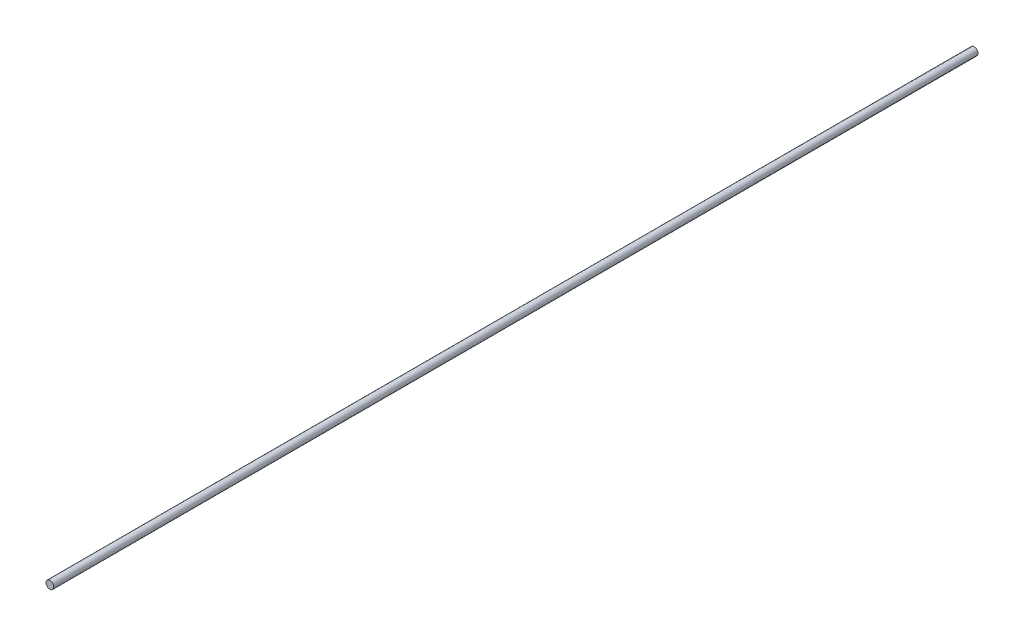
ISO-10303-21;
HEADER;
FILE_DESCRIPTION(('STEP AP214'),'2;1');
FILE_NAME('part.step','',(''),(''),'','','');
FILE_SCHEMA(('AUTOMOTIVE_DESIGN { 1 0 10303 214 1 1 1 1 }'));
ENDSEC;
DATA;
#1=APPLICATION_CONTEXT('core data for automotive mechanical design processes');
#2=APPLICATION_PROTOCOL_DEFINITION('international standard','automotive_design',2000,#1);
#3=PRODUCT_CONTEXT('',#1,'mechanical');
#4=PRODUCT('Part','Part','',(#3));
#5=PRODUCT_RELATED_PRODUCT_CATEGORY('part','',(#4));
#6=PRODUCT_DEFINITION_FORMATION('','',#4);
#7=PRODUCT_DEFINITION_CONTEXT('part definition',#1,'design');
#8=PRODUCT_DEFINITION('design','',#6,#7);
#9=PRODUCT_DEFINITION_SHAPE('','',#8);
#10=(LENGTH_UNIT() NAMED_UNIT(*) SI_UNIT(.MILLI.,.METRE.));
#11=(NAMED_UNIT(*) PLANE_ANGLE_UNIT() SI_UNIT($,.RADIAN.));
#12=(NAMED_UNIT(*) SI_UNIT($,.STERADIAN.) SOLID_ANGLE_UNIT());
#13=UNCERTAINTY_MEASURE_WITH_UNIT(LENGTH_MEASURE(1.E-05),#10,'distance_accuracy_value','');
#14=(GEOMETRIC_REPRESENTATION_CONTEXT(3) GLOBAL_UNCERTAINTY_ASSIGNED_CONTEXT((#13)) GLOBAL_UNIT_ASSIGNED_CONTEXT((#10,
#11,#12)) REPRESENTATION_CONTEXT('',''));
#15=CARTESIAN_POINT('',(0.,0.,0.));
#16=DIRECTION('',(0.,0.,1.));
#17=DIRECTION('',(1.,0.,0.));
#18=AXIS2_PLACEMENT_3D('',#15,#16,#17);
#19=CARTESIAN_POINT('',(0.,0.,762.));
#20=DIRECTION('',(0.,0.,-1.));
#21=DIRECTION('',(-1.,0.,0.));
#22=AXIS2_PLACEMENT_3D('',#19,#20,#21);
#23=CYLINDRICAL_SURFACE('',#22,6.35);
#24=CARTESIAN_POINT('',(0.,0.,762.));
#25=DIRECTION('',(0.,0.,1.));
#26=DIRECTION('',(1.,0.,0.));
#27=AXIS2_PLACEMENT_3D('',#24,#25,#26);
#28=CIRCLE('',#27,6.35);
#29=CARTESIAN_POINT('',(6.35,0.,762.));
#30=VERTEX_POINT('',#29);
#31=EDGE_CURVE('E10',#30,#30,#28,.T.);
#32=ORIENTED_EDGE('',*,*,#31,.F.);
#33=EDGE_LOOP('',(#32));
#34=FACE_BOUND('',#33,.T.);
#35=CARTESIAN_POINT('',(0.,0.,-762.));
#36=DIRECTION('',(0.,0.,1.));
#37=DIRECTION('',(1.,0.,0.));
#38=AXIS2_PLACEMENT_3D('',#35,#36,#37);
#39=CIRCLE('',#38,6.35);
#40=CARTESIAN_POINT('',(6.35,0.,-762.));
#41=VERTEX_POINT('',#40);
#42=EDGE_CURVE('E33',#41,#41,#39,.T.);
#43=ORIENTED_EDGE('',*,*,#42,.T.);
#44=EDGE_LOOP('',(#43));
#45=FACE_BOUND('',#44,.T.);
#46=ADVANCED_FACE('F30',(#34,#45),#23,.T.);
#47=CARTESIAN_POINT('',(0.,0.,762.));
#48=DIRECTION('',(0.,0.,1.));
#49=DIRECTION('',(1.,0.,0.));
#50=AXIS2_PLACEMENT_3D('',#47,#48,#49);
#51=PLANE('',#50);
#52=ORIENTED_EDGE('',*,*,#31,.T.);
#53=EDGE_LOOP('',(#52));
#54=FACE_BOUND('',#53,.T.);
#55=ADVANCED_FACE('F45',(#54),#51,.T.);
#56=CARTESIAN_POINT('',(0.,0.,-762.));
#57=DIRECTION('',(0.,0.,1.));
#58=DIRECTION('',(1.,0.,0.));
#59=AXIS2_PLACEMENT_3D('',#56,#57,#58);
#60=PLANE('',#59);
#61=ORIENTED_EDGE('',*,*,#42,.F.);
#62=EDGE_LOOP('',(#61));
#63=FACE_BOUND('',#62,.T.);
#64=ADVANCED_FACE('F43',(#63),#60,.F.);
#65=CLOSED_SHELL('',(#46,#55,#64));
#66=MANIFOLD_SOLID_BREP('B2',#65);
#67=ADVANCED_BREP_SHAPE_REPRESENTATION('',(#18,#66),#14);
#68=SHAPE_DEFINITION_REPRESENTATION(#9,#67);
ENDSEC;
END-ISO-10303-21;
